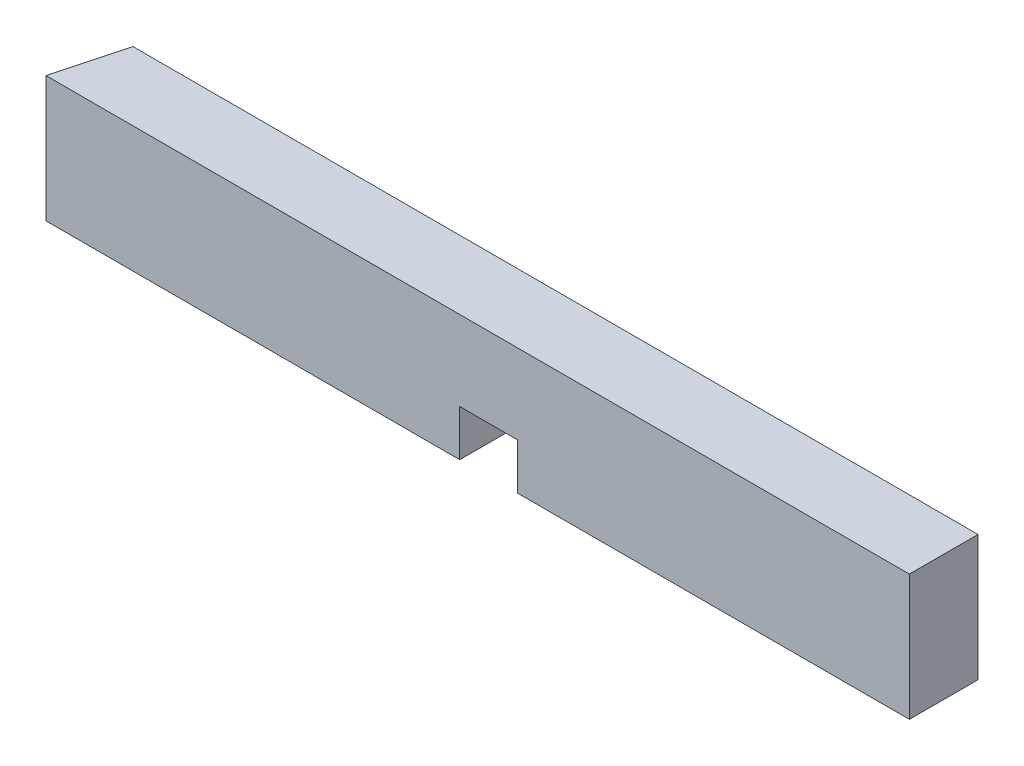
ISO-10303-21;
HEADER;
FILE_DESCRIPTION(('STEP AP214'),'2;1');
FILE_NAME('part.step','',(''),(''),'','','');
FILE_SCHEMA(('AUTOMOTIVE_DESIGN { 1 0 10303 214 1 1 1 1 }'));
ENDSEC;
DATA;
#1=APPLICATION_CONTEXT('core data for automotive mechanical design processes');
#2=APPLICATION_PROTOCOL_DEFINITION('international standard','automotive_design',2000,#1);
#3=PRODUCT_CONTEXT('',#1,'mechanical');
#4=PRODUCT('Part','Part','',(#3));
#5=PRODUCT_RELATED_PRODUCT_CATEGORY('part','',(#4));
#6=PRODUCT_DEFINITION_FORMATION('','',#4);
#7=PRODUCT_DEFINITION_CONTEXT('part definition',#1,'design');
#8=PRODUCT_DEFINITION('design','',#6,#7);
#9=PRODUCT_DEFINITION_SHAPE('','',#8);
#10=(LENGTH_UNIT() NAMED_UNIT(*) SI_UNIT(.MILLI.,.METRE.));
#11=(NAMED_UNIT(*) PLANE_ANGLE_UNIT() SI_UNIT($,.RADIAN.));
#12=(NAMED_UNIT(*) SI_UNIT($,.STERADIAN.) SOLID_ANGLE_UNIT());
#13=UNCERTAINTY_MEASURE_WITH_UNIT(LENGTH_MEASURE(1.E-05),#10,'distance_accuracy_value','');
#14=(GEOMETRIC_REPRESENTATION_CONTEXT(3) GLOBAL_UNCERTAINTY_ASSIGNED_CONTEXT((#13)) GLOBAL_UNIT_ASSIGNED_CONTEXT((#10,
#11,#12)) REPRESENTATION_CONTEXT('',''));
#15=CARTESIAN_POINT('',(0.,0.,0.));
#16=DIRECTION('',(0.,0.,1.));
#17=DIRECTION('',(1.,0.,0.));
#18=AXIS2_PLACEMENT_3D('',#15,#16,#17);
#19=CARTESIAN_POINT('',(0.,0.,4.7244));
#20=DIRECTION('',(0.,1.,0.));
#21=DIRECTION('',(0.,0.,1.));
#22=AXIS2_PLACEMENT_3D('',#19,#20,#21);
#23=PLANE('',#22);
#24=DIRECTION('',(0.,0.,1.));
#25=VECTOR('',#24,1.);
#26=CARTESIAN_POINT('',(27.78125,0.,-1.2E-05));
#27=LINE('',#26,#25);
#28=CARTESIAN_POINT('',(27.78125,0.,0.));
#29=VERTEX_POINT('',#28);
#30=CARTESIAN_POINT('',(27.78125,0.,4.7244));
#31=VERTEX_POINT('',#30);
#32=EDGE_CURVE('E126',#29,#31,#27,.T.);
#33=ORIENTED_EDGE('',*,*,#32,.T.);
#34=DIRECTION('',(1.,0.,0.));
#35=VECTOR('',#34,1.);
#36=CARTESIAN_POINT('',(0.,0.,4.7244));
#37=LINE('',#36,#35);
#38=CARTESIAN_POINT('',(-0.698499999999998,0.,4.72440000000001));
#39=VERTEX_POINT('',#38);
#40=EDGE_CURVE('E97',#39,#31,#37,.T.);
#41=ORIENTED_EDGE('',*,*,#40,.F.);
#42=DIRECTION('',(-0.25960106086917,0.,0.965715946433319));
#43=VECTOR('',#42,1.);
#44=CARTESIAN_POINT('',(0.571499999999996,0.,0.));
#45=LINE('',#44,#43);
#46=CARTESIAN_POINT('',(0.571499999999996,0.,0.));
#47=VERTEX_POINT('',#46);
#48=EDGE_CURVE('E152',#47,#39,#45,.T.);
#49=ORIENTED_EDGE('',*,*,#48,.F.);
#50=DIRECTION('',(1.,0.,0.));
#51=VECTOR('',#50,1.);
#52=CARTESIAN_POINT('',(0.,0.,0.));
#53=LINE('',#52,#51);
#54=EDGE_CURVE('E80',#47,#29,#53,.T.);
#55=ORIENTED_EDGE('',*,*,#54,.T.);
#56=EDGE_LOOP('',(#33,#41,#49,#55));
#57=FACE_BOUND('',#56,.T.);
#58=ADVANCED_FACE('F32',(#57),#23,.F.);
#59=CARTESIAN_POINT('',(31.75,0.,4.7244));
#60=VERTEX_POINT('',#59);
#61=CARTESIAN_POINT('',(58.7375,0.,4.7244));
#62=VERTEX_POINT('',#61);
#63=EDGE_CURVE('E95',#60,#62,#37,.T.);
#64=ORIENTED_EDGE('',*,*,#63,.F.);
#65=DIRECTION('',(0.,0.,1.));
#66=VECTOR('',#65,1.);
#67=CARTESIAN_POINT('',(31.75,0.,-1.2E-05));
#68=LINE('',#67,#66);
#69=CARTESIAN_POINT('',(31.75,0.,0.));
#70=VERTEX_POINT('',#69);
#71=EDGE_CURVE('E119',#70,#60,#68,.T.);
#72=ORIENTED_EDGE('',*,*,#71,.F.);
#73=CARTESIAN_POINT('',(58.7375,0.,0.));
#74=VERTEX_POINT('',#73);
#75=EDGE_CURVE('E114',#70,#74,#53,.T.);
#76=ORIENTED_EDGE('',*,*,#75,.T.);
#77=DIRECTION('',(0.,0.,-1.));
#78=VECTOR('',#77,1.);
#79=CARTESIAN_POINT('',(58.7375,0.,4.7244));
#80=LINE('',#79,#78);
#81=EDGE_CURVE('E75',#62,#74,#80,.T.);
#82=ORIENTED_EDGE('',*,*,#81,.F.);
#83=EDGE_LOOP('',(#64,#72,#76,#82));
#84=FACE_BOUND('',#83,.T.);
#85=ADVANCED_FACE('F34',(#84),#23,.F.);
#86=CARTESIAN_POINT('',(58.7375,0.,4.7244));
#87=DIRECTION('',(-1.,0.,0.));
#88=DIRECTION('',(0.,0.,1.));
#89=AXIS2_PLACEMENT_3D('',#86,#87,#88);
#90=PLANE('',#89);
#91=DIRECTION('',(0.,1.,0.));
#92=VECTOR('',#91,1.);
#93=CARTESIAN_POINT('',(58.7375,0.,0.));
#94=LINE('',#93,#92);
#95=CARTESIAN_POINT('',(58.7375,8.6614,0.));
#96=VERTEX_POINT('',#95);
#97=EDGE_CURVE('E69',#74,#96,#94,.T.);
#98=ORIENTED_EDGE('',*,*,#97,.T.);
#99=DIRECTION('',(0.,0.,-1.));
#100=VECTOR('',#99,1.);
#101=CARTESIAN_POINT('',(58.7375,8.6614,4.7244));
#102=LINE('',#101,#100);
#103=CARTESIAN_POINT('',(58.7375,8.6614,4.7244));
#104=VERTEX_POINT('',#103);
#105=EDGE_CURVE('E72',#104,#96,#102,.T.);
#106=ORIENTED_EDGE('',*,*,#105,.F.);
#107=DIRECTION('',(0.,1.,0.));
#108=VECTOR('',#107,1.);
#109=CARTESIAN_POINT('',(58.7375,0.,4.7244));
#110=LINE('',#109,#108);
#111=EDGE_CURVE('E56',#62,#104,#110,.T.);
#112=ORIENTED_EDGE('',*,*,#111,.F.);
#113=ORIENTED_EDGE('',*,*,#81,.T.);
#114=EDGE_LOOP('',(#98,#106,#112,#113));
#115=FACE_BOUND('',#114,.T.);
#116=ADVANCED_FACE('F71',(#115),#90,.F.);
#117=CARTESIAN_POINT('',(0.,8.6614,4.7244));
#118=DIRECTION('',(0.,-1.,0.));
#119=DIRECTION('',(0.,0.,-1.));
#120=AXIS2_PLACEMENT_3D('',#117,#118,#119);
#121=PLANE('',#120);
#122=DIRECTION('',(-1.,0.,0.));
#123=VECTOR('',#122,1.);
#124=CARTESIAN_POINT('',(0.,8.6614,0.));
#125=LINE('',#124,#123);
#126=CARTESIAN_POINT('',(0.571499999999996,8.6614,0.));
#127=VERTEX_POINT('',#126);
#128=EDGE_CURVE('E79',#96,#127,#125,.T.);
#129=ORIENTED_EDGE('',*,*,#128,.T.);
#130=DIRECTION('',(-0.25960106086917,0.,0.965715946433319));
#131=VECTOR('',#130,1.);
#132=CARTESIAN_POINT('',(0.571499999999996,8.6614,0.));
#133=LINE('',#132,#131);
#134=CARTESIAN_POINT('',(-0.698499999999998,8.6614,4.72440000000001));
#135=VERTEX_POINT('',#134);
#136=EDGE_CURVE('E153',#127,#135,#133,.T.);
#137=ORIENTED_EDGE('',*,*,#136,.T.);
#138=DIRECTION('',(-1.,0.,0.));
#139=VECTOR('',#138,1.);
#140=CARTESIAN_POINT('',(0.,8.6614,4.7244));
#141=LINE('',#140,#139);
#142=EDGE_CURVE('E88',#104,#135,#141,.T.);
#143=ORIENTED_EDGE('',*,*,#142,.F.);
#144=ORIENTED_EDGE('',*,*,#105,.T.);
#145=EDGE_LOOP('',(#129,#137,#143,#144));
#146=FACE_BOUND('',#145,.T.);
#147=ADVANCED_FACE('F84',(#146),#121,.F.);
#148=CARTESIAN_POINT('',(0.,0.,4.7244));
#149=DIRECTION('',(0.,0.,-1.));
#150=DIRECTION('',(-1.,0.,0.));
#151=AXIS2_PLACEMENT_3D('',#148,#149,#150);
#152=PLANE('',#151);
#153=ORIENTED_EDGE('',*,*,#142,.T.);
#154=DIRECTION('',(0.,1.,0.));
#155=VECTOR('',#154,1.);
#156=CARTESIAN_POINT('',(-0.698499999999998,0.,4.72440000000001));
#157=LINE('',#156,#155);
#158=EDGE_CURVE('E149',#39,#135,#157,.T.);
#159=ORIENTED_EDGE('',*,*,#158,.F.);
#160=ORIENTED_EDGE('',*,*,#40,.T.);
#161=DIRECTION('',(0.,-1.,0.));
#162=VECTOR('',#161,1.);
#163=CARTESIAN_POINT('',(27.78125,0.,4.7244));
#164=LINE('',#163,#162);
#165=CARTESIAN_POINT('',(27.78125,3.175,4.7244));
#166=VERTEX_POINT('',#165);
#167=EDGE_CURVE('E146',#166,#31,#164,.T.);
#168=ORIENTED_EDGE('',*,*,#167,.F.);
#169=DIRECTION('',(-1.,0.,0.));
#170=VECTOR('',#169,1.);
#171=CARTESIAN_POINT('',(27.78125,3.175,4.7244));
#172=LINE('',#171,#170);
#173=CARTESIAN_POINT('',(31.75,3.175,4.7244));
#174=VERTEX_POINT('',#173);
#175=EDGE_CURVE('E130',#174,#166,#172,.T.);
#176=ORIENTED_EDGE('',*,*,#175,.F.);
#177=DIRECTION('',(0.,1.,0.));
#178=VECTOR('',#177,1.);
#179=CARTESIAN_POINT('',(31.75,0.,4.7244));
#180=LINE('',#179,#178);
#181=EDGE_CURVE('E144',#60,#174,#180,.T.);
#182=ORIENTED_EDGE('',*,*,#181,.F.);
#183=ORIENTED_EDGE('',*,*,#63,.T.);
#184=ORIENTED_EDGE('',*,*,#111,.T.);
#185=EDGE_LOOP('',(#153,#159,#160,#168,#176,#182,#183,#184));
#186=FACE_BOUND('',#185,.T.);
#187=ADVANCED_FACE('F176',(#186),#152,.F.);
#188=CARTESIAN_POINT('',(0.,0.,0.));
#189=DIRECTION('',(0.,0.,-1.));
#190=DIRECTION('',(-1.,0.,0.));
#191=AXIS2_PLACEMENT_3D('',#188,#189,#190);
#192=PLANE('',#191);
#193=DIRECTION('',(0.,1.,0.));
#194=VECTOR('',#193,1.);
#195=CARTESIAN_POINT('',(0.571499999999996,0.,0.));
#196=LINE('',#195,#194);
#197=EDGE_CURVE('E93',#47,#127,#196,.T.);
#198=ORIENTED_EDGE('',*,*,#197,.T.);
#199=ORIENTED_EDGE('',*,*,#128,.F.);
#200=ORIENTED_EDGE('',*,*,#97,.F.);
#201=ORIENTED_EDGE('',*,*,#75,.F.);
#202=DIRECTION('',(0.,-1.,0.));
#203=VECTOR('',#202,1.);
#204=CARTESIAN_POINT('',(31.75,0.,0.));
#205=LINE('',#204,#203);
#206=CARTESIAN_POINT('',(31.75,3.175,0.));
#207=VERTEX_POINT('',#206);
#208=EDGE_CURVE('E102',#207,#70,#205,.T.);
#209=ORIENTED_EDGE('',*,*,#208,.F.);
#210=DIRECTION('',(1.,0.,0.));
#211=VECTOR('',#210,1.);
#212=CARTESIAN_POINT('',(0.,3.175,0.));
#213=LINE('',#212,#211);
#214=CARTESIAN_POINT('',(27.78125,3.175,0.));
#215=VERTEX_POINT('',#214);
#216=EDGE_CURVE('E40',#215,#207,#213,.T.);
#217=ORIENTED_EDGE('',*,*,#216,.F.);
#218=DIRECTION('',(0.,1.,0.));
#219=VECTOR('',#218,1.);
#220=CARTESIAN_POINT('',(27.78125,0.,0.));
#221=LINE('',#220,#219);
#222=EDGE_CURVE('E11',#29,#215,#221,.T.);
#223=ORIENTED_EDGE('',*,*,#222,.F.);
#224=ORIENTED_EDGE('',*,*,#54,.F.);
#225=EDGE_LOOP('',(#198,#199,#200,#201,#209,#217,#223,#224));
#226=FACE_BOUND('',#225,.T.);
#227=ADVANCED_FACE('F90',(#226),#192,.T.);
#228=CARTESIAN_POINT('',(27.78125,0.,-1.2E-05));
#229=DIRECTION('',(-1.,0.,0.));
#230=DIRECTION('',(0.,0.,1.));
#231=AXIS2_PLACEMENT_3D('',#228,#229,#230);
#232=PLANE('',#231);
#233=ORIENTED_EDGE('',*,*,#222,.T.);
#234=DIRECTION('',(0.,0.,1.));
#235=VECTOR('',#234,1.);
#236=CARTESIAN_POINT('',(27.78125,3.175,-1.2E-05));
#237=LINE('',#236,#235);
#238=EDGE_CURVE('E111',#215,#166,#237,.T.);
#239=ORIENTED_EDGE('',*,*,#238,.T.);
#240=ORIENTED_EDGE('',*,*,#167,.T.);
#241=ORIENTED_EDGE('',*,*,#32,.F.);
#242=EDGE_LOOP('',(#233,#239,#240,#241));
#243=FACE_BOUND('',#242,.T.);
#244=ADVANCED_FACE('F173',(#243),#232,.F.);
#245=CARTESIAN_POINT('',(27.78125,3.175,-1.2E-05));
#246=DIRECTION('',(0.,1.,0.));
#247=DIRECTION('',(0.,0.,1.));
#248=AXIS2_PLACEMENT_3D('',#245,#246,#247);
#249=PLANE('',#248);
#250=ORIENTED_EDGE('',*,*,#216,.T.);
#251=DIRECTION('',(0.,0.,1.));
#252=VECTOR('',#251,1.);
#253=CARTESIAN_POINT('',(31.75,3.175,-1.2E-05));
#254=LINE('',#253,#252);
#255=EDGE_CURVE('E47',#207,#174,#254,.T.);
#256=ORIENTED_EDGE('',*,*,#255,.T.);
#257=ORIENTED_EDGE('',*,*,#175,.T.);
#258=ORIENTED_EDGE('',*,*,#238,.F.);
#259=EDGE_LOOP('',(#250,#256,#257,#258));
#260=FACE_BOUND('',#259,.T.);
#261=ADVANCED_FACE('F107',(#260),#249,.F.);
#262=CARTESIAN_POINT('',(31.75,0.,-1.2E-05));
#263=DIRECTION('',(1.,0.,0.));
#264=DIRECTION('',(0.,0.,-1.));
#265=AXIS2_PLACEMENT_3D('',#262,#263,#264);
#266=PLANE('',#265);
#267=ORIENTED_EDGE('',*,*,#208,.T.);
#268=ORIENTED_EDGE('',*,*,#71,.T.);
#269=ORIENTED_EDGE('',*,*,#181,.T.);
#270=ORIENTED_EDGE('',*,*,#255,.F.);
#271=EDGE_LOOP('',(#267,#268,#269,#270));
#272=FACE_BOUND('',#271,.T.);
#273=ADVANCED_FACE('F117',(#272),#266,.F.);
#274=CARTESIAN_POINT('',(0.571499999999996,0.,0.));
#275=DIRECTION('',(-0.965715946433319,0.,-0.25960106086917));
#276=DIRECTION('',(-0.25960106086917,0.,0.965715946433319));
#277=AXIS2_PLACEMENT_3D('',#274,#275,#276);
#278=PLANE('',#277);
#279=ORIENTED_EDGE('',*,*,#136,.F.);
#280=ORIENTED_EDGE('',*,*,#197,.F.);
#281=ORIENTED_EDGE('',*,*,#48,.T.);
#282=ORIENTED_EDGE('',*,*,#158,.T.);
#283=EDGE_LOOP('',(#279,#280,#281,#282));
#284=FACE_BOUND('',#283,.T.);
#285=ADVANCED_FACE('F158',(#284),#278,.T.);
#286=CLOSED_SHELL('',(#58,#85,#116,#147,#187,#227,#244,#261,#273,#285));
#287=MANIFOLD_SOLID_BREP('B2',#286);
#288=ADVANCED_BREP_SHAPE_REPRESENTATION('',(#18,#287),#14);
#289=SHAPE_DEFINITION_REPRESENTATION(#9,#288);
ENDSEC;
END-ISO-10303-21;
